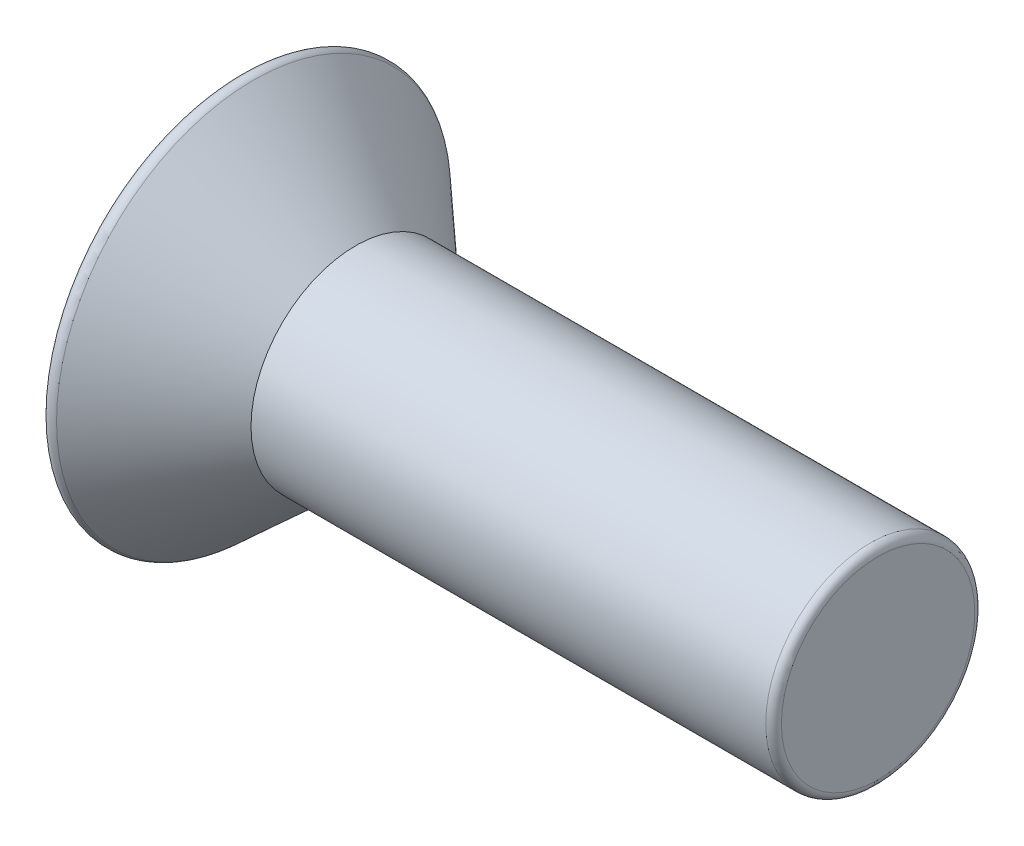
ISO-10303-21;
HEADER;
FILE_DESCRIPTION(('STEP AP214'),'2;1');
FILE_NAME('part.step','',(''),(''),'','','');
FILE_SCHEMA(('AUTOMOTIVE_DESIGN { 1 0 10303 214 1 1 1 1 }'));
ENDSEC;
DATA;
#1=APPLICATION_CONTEXT('core data for automotive mechanical design processes');
#2=APPLICATION_PROTOCOL_DEFINITION('international standard','automotive_design',2000,#1);
#3=PRODUCT_CONTEXT('',#1,'mechanical');
#4=PRODUCT('Part','Part','',(#3));
#5=PRODUCT_RELATED_PRODUCT_CATEGORY('part','',(#4));
#6=PRODUCT_DEFINITION_FORMATION('','',#4);
#7=PRODUCT_DEFINITION_CONTEXT('part definition',#1,'design');
#8=PRODUCT_DEFINITION('design','',#6,#7);
#9=PRODUCT_DEFINITION_SHAPE('','',#8);
#10=(LENGTH_UNIT() NAMED_UNIT(*) SI_UNIT(.MILLI.,.METRE.));
#11=(NAMED_UNIT(*) PLANE_ANGLE_UNIT() SI_UNIT($,.RADIAN.));
#12=(NAMED_UNIT(*) SI_UNIT($,.STERADIAN.) SOLID_ANGLE_UNIT());
#13=UNCERTAINTY_MEASURE_WITH_UNIT(LENGTH_MEASURE(1.E-05),#10,'distance_accuracy_value','');
#14=(GEOMETRIC_REPRESENTATION_CONTEXT(3) GLOBAL_UNCERTAINTY_ASSIGNED_CONTEXT((#13)) GLOBAL_UNIT_ASSIGNED_CONTEXT((#10,
#11,#12)) REPRESENTATION_CONTEXT('',''));
#15=CARTESIAN_POINT('',(0.,0.,0.));
#16=DIRECTION('',(0.,0.,1.));
#17=DIRECTION('',(1.,0.,0.));
#18=AXIS2_PLACEMENT_3D('',#15,#16,#17);
#19=CARTESIAN_POINT('',(0.,0.,0.));
#20=DIRECTION('',(-1.,0.,0.));
#21=DIRECTION('',(0.,0.,1.));
#22=AXIS2_PLACEMENT_3D('',#19,#20,#21);
#23=PLANE('',#22);
#24=CARTESIAN_POINT('',(0.,0.,0.));
#25=DIRECTION('',(-1.,0.,0.));
#26=DIRECTION('',(0.,0.,1.));
#27=AXIS2_PLACEMENT_3D('',#24,#25,#26);
#28=CIRCLE('',#27,3.7);
#29=CARTESIAN_POINT('',(0.,0.,3.7));
#30=VERTEX_POINT('',#29);
#31=EDGE_CURVE('E151',#30,#30,#28,.F.);
#32=ORIENTED_EDGE('',*,*,#31,.T.);
#33=EDGE_LOOP('',(#32));
#34=FACE_BOUND('',#33,.T.);
#35=ADVANCED_FACE('F38',(#34),#23,.F.);
#36=CARTESIAN_POINT('',(-24.4,0.,0.));
#37=DIRECTION('',(-1.,0.,0.));
#38=DIRECTION('',(0.,0.,1.));
#39=AXIS2_PLACEMENT_3D('',#36,#37,#38);
#40=CYLINDRICAL_SURFACE('',#39,4.);
#41=CARTESIAN_POINT('',(-0.300000000000002,0.,0.));
#42=DIRECTION('',(-1.,0.,0.));
#43=DIRECTION('',(0.,0.,1.));
#44=AXIS2_PLACEMENT_3D('',#41,#42,#43);
#45=CIRCLE('',#44,4.);
#46=CARTESIAN_POINT('',(-0.300000000000002,0.,4.));
#47=VERTEX_POINT('',#46);
#48=EDGE_CURVE('E148',#47,#47,#45,.T.);
#49=ORIENTED_EDGE('',*,*,#48,.T.);
#50=EDGE_LOOP('',(#49));
#51=FACE_BOUND('',#50,.T.);
#52=CARTESIAN_POINT('',(-20.,0.,0.));
#53=DIRECTION('',(-1.,0.,0.));
#54=DIRECTION('',(0.,0.,1.));
#55=AXIS2_PLACEMENT_3D('',#52,#53,#54);
#56=CIRCLE('',#55,4.);
#57=CARTESIAN_POINT('',(-20.,0.,4.));
#58=VERTEX_POINT('',#57);
#59=EDGE_CURVE('E140',#58,#58,#56,.T.);
#60=ORIENTED_EDGE('',*,*,#59,.F.);
#61=EDGE_LOOP('',(#60));
#62=FACE_BOUND('',#61,.T.);
#63=ADVANCED_FACE('F168',(#51,#62),#40,.T.);
#64=CARTESIAN_POINT('',(-20.,0.,0.));
#65=DIRECTION('',(-1.,0.,0.));
#66=DIRECTION('',(0.,0.,1.));
#67=AXIS2_PLACEMENT_3D('',#64,#65,#66);
#68=CONICAL_SURFACE('',#67,4.,0.737815060120465);
#69=CARTESIAN_POINT('',(-23.8981981618011,0.,0.));
#70=DIRECTION('',(1.,0.,0.));
#71=DIRECTION('',(0.,0.,-1.));
#72=AXIS2_PLACEMENT_3D('',#69,#70,#71);
#73=CIRCLE('',#72,7.54381651072828);
#74=CARTESIAN_POINT('',(-23.8981981618011,0.,-7.54381651072828));
#75=VERTEX_POINT('',#74);
#76=EDGE_CURVE('E11',#75,#75,#73,.T.);
#77=ORIENTED_EDGE('',*,*,#76,.T.);
#78=EDGE_LOOP('',(#77));
#79=FACE_BOUND('',#78,.T.);
#80=ORIENTED_EDGE('',*,*,#59,.T.);
#81=EDGE_LOOP('',(#80));
#82=FACE_BOUND('',#81,.T.);
#83=ADVANCED_FACE('F174',(#79,#82),#68,.T.);
#84=CARTESIAN_POINT('',(-24.4,8.,0.));
#85=DIRECTION('',(1.,0.,0.));
#86=DIRECTION('',(0.,0.,-1.));
#87=AXIS2_PLACEMENT_3D('',#84,#85,#86);
#88=PLANE('',#87);
#89=CARTESIAN_POINT('',(-24.4,0.,0.));
#90=DIRECTION('',(1.,0.,0.));
#91=DIRECTION('',(0.,0.,-1.));
#92=AXIS2_PLACEMENT_3D('',#89,#90,#91);
#93=CIRCLE('',#92,7.32183448870949);
#94=CARTESIAN_POINT('',(-24.4,0.,-7.32183448870949));
#95=VERTEX_POINT('',#94);
#96=EDGE_CURVE('E46',#95,#95,#93,.F.);
#97=ORIENTED_EDGE('',*,*,#96,.T.);
#98=EDGE_LOOP('',(#97));
#99=FACE_BOUND('',#98,.T.);
#100=DIRECTION('',(0.,0.866025403784438,-0.5));
#101=VECTOR('',#100,1.);
#102=CARTESIAN_POINT('',(-24.4,0.,2.88675134594813));
#103=LINE('',#102,#101);
#104=CARTESIAN_POINT('',(-24.4,0.,2.88675134594813));
#105=VERTEX_POINT('',#104);
#106=CARTESIAN_POINT('',(-24.4,2.5,1.44337567297406));
#107=VERTEX_POINT('',#106);
#108=EDGE_CURVE('E127',#105,#107,#103,.T.);
#109=ORIENTED_EDGE('',*,*,#108,.F.);
#110=DIRECTION('',(0.,0.866025403784439,0.5));
#111=VECTOR('',#110,1.);
#112=CARTESIAN_POINT('',(-24.4,-2.5,1.44337567297406));
#113=LINE('',#112,#111);
#114=CARTESIAN_POINT('',(-24.4,-2.5,1.44337567297406));
#115=VERTEX_POINT('',#114);
#116=EDGE_CURVE('E53',#115,#105,#113,.T.);
#117=ORIENTED_EDGE('',*,*,#116,.F.);
#118=DIRECTION('',(0.,0.,1.));
#119=VECTOR('',#118,1.);
#120=CARTESIAN_POINT('',(-24.4,-2.5,-1.44337567297407));
#121=LINE('',#120,#119);
#122=CARTESIAN_POINT('',(-24.4,-2.5,-1.44337567297407));
#123=VERTEX_POINT('',#122);
#124=EDGE_CURVE('E136',#123,#115,#121,.T.);
#125=ORIENTED_EDGE('',*,*,#124,.F.);
#126=DIRECTION('',(0.,-0.866025403784439,0.5));
#127=VECTOR('',#126,1.);
#128=CARTESIAN_POINT('',(-24.4,0.,-2.88675134594813));
#129=LINE('',#128,#127);
#130=CARTESIAN_POINT('',(-24.4,0.,-2.88675134594813));
#131=VERTEX_POINT('',#130);
#132=EDGE_CURVE('E134',#131,#123,#129,.T.);
#133=ORIENTED_EDGE('',*,*,#132,.F.);
#134=DIRECTION('',(0.,-0.866025403784439,-0.5));
#135=VECTOR('',#134,1.);
#136=CARTESIAN_POINT('',(-24.4,2.5,-1.44337567297407));
#137=LINE('',#136,#135);
#138=CARTESIAN_POINT('',(-24.4,2.5,-1.44337567297407));
#139=VERTEX_POINT('',#138);
#140=EDGE_CURVE('E101',#139,#131,#137,.T.);
#141=ORIENTED_EDGE('',*,*,#140,.F.);
#142=DIRECTION('',(0.,0.,-1.));
#143=VECTOR('',#142,1.);
#144=CARTESIAN_POINT('',(-24.4,2.5,1.44337567297406));
#145=LINE('',#144,#143);
#146=EDGE_CURVE('E130',#107,#139,#145,.T.);
#147=ORIENTED_EDGE('',*,*,#146,.F.);
#148=EDGE_LOOP('',(#109,#117,#125,#133,#141,#147));
#149=FACE_BOUND('',#148,.T.);
#150=ADVANCED_FACE('F156',(#99,#149),#88,.F.);
#151=CARTESIAN_POINT('',(-19.4,-2.5,1.44337567297406));
#152=DIRECTION('',(0.,-0.5,0.866025403784439));
#153=DIRECTION('',(0.,-0.866025403784439,-0.5));
#154=AXIS2_PLACEMENT_3D('',#151,#152,#153);
#155=PLANE('',#154);
#156=ORIENTED_EDGE('',*,*,#116,.T.);
#157=DIRECTION('',(-1.,0.,0.));
#158=VECTOR('',#157,1.);
#159=CARTESIAN_POINT('',(-19.4,0.,2.88675134594813));
#160=LINE('',#159,#158);
#161=CARTESIAN_POINT('',(-19.4,0.,2.88675134594813));
#162=VERTEX_POINT('',#161);
#163=EDGE_CURVE('E83',#162,#105,#160,.T.);
#164=ORIENTED_EDGE('',*,*,#163,.F.);
#165=DIRECTION('',(0.,0.866025403784439,0.5));
#166=VECTOR('',#165,1.);
#167=CARTESIAN_POINT('',(-19.4,-2.5,1.44337567297406));
#168=LINE('',#167,#166);
#169=CARTESIAN_POINT('',(-19.4,-2.5,1.44337567297406));
#170=VERTEX_POINT('',#169);
#171=EDGE_CURVE('E138',#170,#162,#168,.T.);
#172=ORIENTED_EDGE('',*,*,#171,.F.);
#173=DIRECTION('',(-1.,0.,0.));
#174=VECTOR('',#173,1.);
#175=CARTESIAN_POINT('',(-19.4,-2.5,1.44337567297406));
#176=LINE('',#175,#174);
#177=EDGE_CURVE('E61',#170,#115,#176,.T.);
#178=ORIENTED_EDGE('',*,*,#177,.T.);
#179=EDGE_LOOP('',(#156,#164,#172,#178));
#180=FACE_BOUND('',#179,.T.);
#181=ADVANCED_FACE('F183',(#180),#155,.F.);
#182=CARTESIAN_POINT('',(-19.4,-2.5,-1.44337567297407));
#183=DIRECTION('',(0.,-1.,0.));
#184=DIRECTION('',(0.,0.,-1.));
#185=AXIS2_PLACEMENT_3D('',#182,#183,#184);
#186=PLANE('',#185);
#187=ORIENTED_EDGE('',*,*,#124,.T.);
#188=ORIENTED_EDGE('',*,*,#177,.F.);
#189=DIRECTION('',(0.,0.,1.));
#190=VECTOR('',#189,1.);
#191=CARTESIAN_POINT('',(-19.4,-2.5,-1.44337567297407));
#192=LINE('',#191,#190);
#193=CARTESIAN_POINT('',(-19.4,-2.5,-1.44337567297407));
#194=VERTEX_POINT('',#193);
#195=EDGE_CURVE('E113',#194,#170,#192,.T.);
#196=ORIENTED_EDGE('',*,*,#195,.F.);
#197=DIRECTION('',(-1.,0.,0.));
#198=VECTOR('',#197,1.);
#199=CARTESIAN_POINT('',(-19.4,-2.5,-1.44337567297407));
#200=LINE('',#199,#198);
#201=EDGE_CURVE('E105',#194,#123,#200,.T.);
#202=ORIENTED_EDGE('',*,*,#201,.T.);
#203=EDGE_LOOP('',(#187,#188,#196,#202));
#204=FACE_BOUND('',#203,.T.);
#205=ADVANCED_FACE('F186',(#204),#186,.F.);
#206=CARTESIAN_POINT('',(-19.4,0.,-2.88675134594813));
#207=DIRECTION('',(0.,-0.5,-0.866025403784439));
#208=DIRECTION('',(0.,0.866025403784439,-0.5));
#209=AXIS2_PLACEMENT_3D('',#206,#207,#208);
#210=PLANE('',#209);
#211=ORIENTED_EDGE('',*,*,#132,.T.);
#212=ORIENTED_EDGE('',*,*,#201,.F.);
#213=DIRECTION('',(0.,-0.866025403784439,0.5));
#214=VECTOR('',#213,1.);
#215=CARTESIAN_POINT('',(-19.4,0.,-2.88675134594813));
#216=LINE('',#215,#214);
#217=CARTESIAN_POINT('',(-19.4,0.,-2.88675134594813));
#218=VERTEX_POINT('',#217);
#219=EDGE_CURVE('E109',#218,#194,#216,.T.);
#220=ORIENTED_EDGE('',*,*,#219,.F.);
#221=DIRECTION('',(-1.,0.,0.));
#222=VECTOR('',#221,1.);
#223=CARTESIAN_POINT('',(-19.4,0.,-2.88675134594813));
#224=LINE('',#223,#222);
#225=EDGE_CURVE('E94',#218,#131,#224,.T.);
#226=ORIENTED_EDGE('',*,*,#225,.T.);
#227=EDGE_LOOP('',(#211,#212,#220,#226));
#228=FACE_BOUND('',#227,.T.);
#229=ADVANCED_FACE('F110',(#228),#210,.F.);
#230=CARTESIAN_POINT('',(-19.4,2.5,-1.44337567297407));
#231=DIRECTION('',(0.,0.5,-0.866025403784439));
#232=DIRECTION('',(0.,0.866025403784439,0.5));
#233=AXIS2_PLACEMENT_3D('',#230,#231,#232);
#234=PLANE('',#233);
#235=ORIENTED_EDGE('',*,*,#140,.T.);
#236=ORIENTED_EDGE('',*,*,#225,.F.);
#237=DIRECTION('',(0.,-0.866025403784439,-0.5));
#238=VECTOR('',#237,1.);
#239=CARTESIAN_POINT('',(-19.4,2.5,-1.44337567297407));
#240=LINE('',#239,#238);
#241=CARTESIAN_POINT('',(-19.4,2.5,-1.44337567297407));
#242=VERTEX_POINT('',#241);
#243=EDGE_CURVE('E98',#242,#218,#240,.T.);
#244=ORIENTED_EDGE('',*,*,#243,.F.);
#245=DIRECTION('',(-1.,0.,0.));
#246=VECTOR('',#245,1.);
#247=CARTESIAN_POINT('',(-19.4,2.5,-1.44337567297407));
#248=LINE('',#247,#246);
#249=EDGE_CURVE('E106',#242,#139,#248,.T.);
#250=ORIENTED_EDGE('',*,*,#249,.T.);
#251=EDGE_LOOP('',(#235,#236,#244,#250));
#252=FACE_BOUND('',#251,.T.);
#253=ADVANCED_FACE('F96',(#252),#234,.F.);
#254=CARTESIAN_POINT('',(-19.4,2.5,1.44337567297406));
#255=DIRECTION('',(0.,1.,0.));
#256=DIRECTION('',(0.,0.,1.));
#257=AXIS2_PLACEMENT_3D('',#254,#255,#256);
#258=PLANE('',#257);
#259=ORIENTED_EDGE('',*,*,#146,.T.);
#260=ORIENTED_EDGE('',*,*,#249,.F.);
#261=DIRECTION('',(0.,0.,-1.));
#262=VECTOR('',#261,1.);
#263=CARTESIAN_POINT('',(-19.4,2.5,1.44337567297406));
#264=LINE('',#263,#262);
#265=CARTESIAN_POINT('',(-19.4,2.5,1.44337567297406));
#266=VERTEX_POINT('',#265);
#267=EDGE_CURVE('E119',#266,#242,#264,.T.);
#268=ORIENTED_EDGE('',*,*,#267,.F.);
#269=DIRECTION('',(-1.,0.,0.));
#270=VECTOR('',#269,1.);
#271=CARTESIAN_POINT('',(-19.4,2.5,1.44337567297406));
#272=LINE('',#271,#270);
#273=EDGE_CURVE('E143',#266,#107,#272,.T.);
#274=ORIENTED_EDGE('',*,*,#273,.T.);
#275=EDGE_LOOP('',(#259,#260,#268,#274));
#276=FACE_BOUND('',#275,.T.);
#277=ADVANCED_FACE('F190',(#276),#258,.F.);
#278=CARTESIAN_POINT('',(-19.4,0.,2.88675134594813));
#279=DIRECTION('',(0.,0.5,0.866025403784439));
#280=DIRECTION('',(0.,-0.866025403784439,0.5));
#281=AXIS2_PLACEMENT_3D('',#278,#279,#280);
#282=PLANE('',#281);
#283=ORIENTED_EDGE('',*,*,#108,.T.);
#284=ORIENTED_EDGE('',*,*,#273,.F.);
#285=DIRECTION('',(0.,0.866025403784438,-0.5));
#286=VECTOR('',#285,1.);
#287=CARTESIAN_POINT('',(-19.4,0.,2.88675134594813));
#288=LINE('',#287,#286);
#289=EDGE_CURVE('E121',#162,#266,#288,.T.);
#290=ORIENTED_EDGE('',*,*,#289,.F.);
#291=ORIENTED_EDGE('',*,*,#163,.T.);
#292=EDGE_LOOP('',(#283,#284,#290,#291));
#293=FACE_BOUND('',#292,.T.);
#294=ADVANCED_FACE('F187',(#293),#282,.F.);
#295=CARTESIAN_POINT('',(-19.4,0.,0.));
#296=DIRECTION('',(-1.,0.,0.));
#297=DIRECTION('',(0.,0.,1.));
#298=AXIS2_PLACEMENT_3D('',#295,#296,#297);
#299=PLANE('',#298);
#300=ORIENTED_EDGE('',*,*,#171,.T.);
#301=ORIENTED_EDGE('',*,*,#289,.T.);
#302=ORIENTED_EDGE('',*,*,#267,.T.);
#303=ORIENTED_EDGE('',*,*,#243,.T.);
#304=ORIENTED_EDGE('',*,*,#219,.T.);
#305=ORIENTED_EDGE('',*,*,#195,.T.);
#306=EDGE_LOOP('',(#300,#301,#302,#303,#304,#305));
#307=FACE_BOUND('',#306,.T.);
#308=ADVANCED_FACE('F116',(#307),#299,.T.);
#309=CARTESIAN_POINT('',(-0.300000000000002,0.,0.));
#310=DIRECTION('',(-1.,0.,0.));
#311=DIRECTION('',(0.,0.,1.));
#312=AXIS2_PLACEMENT_3D('',#309,#310,#311);
#313=TOROIDAL_SURFACE('',#312,3.7,0.3);
#314=ORIENTED_EDGE('',*,*,#31,.F.);
#315=EDGE_LOOP('',(#314));
#316=FACE_BOUND('',#315,.T.);
#317=ORIENTED_EDGE('',*,*,#48,.F.);
#318=EDGE_LOOP('',(#317));
#319=FACE_BOUND('',#318,.T.);
#320=ADVANCED_FACE('F160',(#316,#319),#313,.T.);
#321=CARTESIAN_POINT('',(-24.1,0.,0.));
#322=DIRECTION('',(1.,0.,0.));
#323=DIRECTION('',(0.,0.,-1.));
#324=AXIS2_PLACEMENT_3D('',#321,#322,#323);
#325=TOROIDAL_SURFACE('',#324,7.32183448870949,0.3);
#326=ORIENTED_EDGE('',*,*,#76,.F.);
#327=EDGE_LOOP('',(#326));
#328=FACE_BOUND('',#327,.T.);
#329=ORIENTED_EDGE('',*,*,#96,.F.);
#330=EDGE_LOOP('',(#329));
#331=FACE_BOUND('',#330,.T.);
#332=ADVANCED_FACE('F40',(#328,#331),#325,.T.);
#333=CLOSED_SHELL('',(#35,#63,#83,#150,#181,#205,#229,#253,#277,#294,#308,#320,#332));
#334=MANIFOLD_SOLID_BREP('B2',#333);
#335=ADVANCED_BREP_SHAPE_REPRESENTATION('',(#18,#334),#14);
#336=SHAPE_DEFINITION_REPRESENTATION(#9,#335);
ENDSEC;
END-ISO-10303-21;
